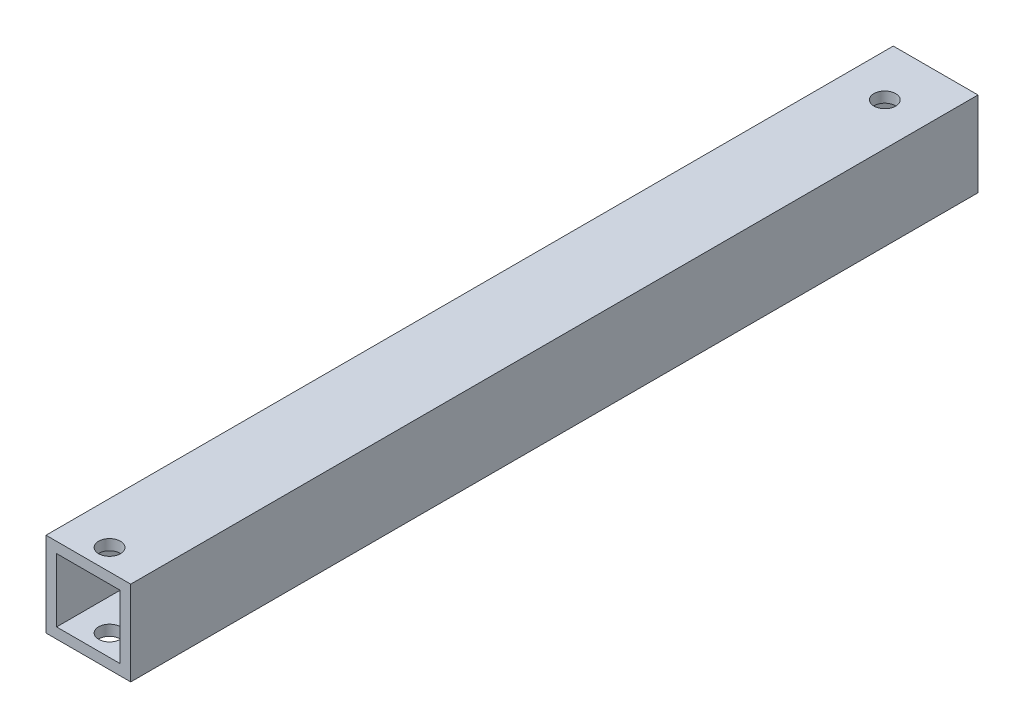
ISO-10303-21;
HEADER;
FILE_DESCRIPTION(('STEP AP214'),'2;1');
FILE_NAME('part.step','',(''),(''),'','','');
FILE_SCHEMA(('AUTOMOTIVE_DESIGN { 1 0 10303 214 1 1 1 1 }'));
ENDSEC;
DATA;
#1=APPLICATION_CONTEXT('core data for automotive mechanical design processes');
#2=APPLICATION_PROTOCOL_DEFINITION('international standard','automotive_design',2000,#1);
#3=PRODUCT_CONTEXT('',#1,'mechanical');
#4=PRODUCT('Part','Part','',(#3));
#5=PRODUCT_RELATED_PRODUCT_CATEGORY('part','',(#4));
#6=PRODUCT_DEFINITION_FORMATION('','',#4);
#7=PRODUCT_DEFINITION_CONTEXT('part definition',#1,'design');
#8=PRODUCT_DEFINITION('design','',#6,#7);
#9=PRODUCT_DEFINITION_SHAPE('','',#8);
#10=(LENGTH_UNIT() NAMED_UNIT(*) SI_UNIT(.MILLI.,.METRE.));
#11=(NAMED_UNIT(*) PLANE_ANGLE_UNIT() SI_UNIT($,.RADIAN.));
#12=(NAMED_UNIT(*) SI_UNIT($,.STERADIAN.) SOLID_ANGLE_UNIT());
#13=UNCERTAINTY_MEASURE_WITH_UNIT(LENGTH_MEASURE(1.E-05),#10,'distance_accuracy_value','');
#14=(GEOMETRIC_REPRESENTATION_CONTEXT(3) GLOBAL_UNCERTAINTY_ASSIGNED_CONTEXT((#13)) GLOBAL_UNIT_ASSIGNED_CONTEXT((#10,
#11,#12)) REPRESENTATION_CONTEXT('',''));
#15=CARTESIAN_POINT('',(0.,0.,0.));
#16=DIRECTION('',(0.,0.,1.));
#17=DIRECTION('',(1.,0.,0.));
#18=AXIS2_PLACEMENT_3D('',#15,#16,#17);
#19=CARTESIAN_POINT('',(0.,0.,254.));
#20=DIRECTION('',(0.,0.,-1.));
#21=DIRECTION('',(-1.,0.,0.));
#22=AXIS2_PLACEMENT_3D('',#19,#20,#21);
#23=PLANE('',#22);
#24=DIRECTION('',(-1.,0.,0.));
#25=VECTOR('',#24,1.);
#26=CARTESIAN_POINT('',(12.7000000000001,-12.7,254.));
#27=LINE('',#26,#25);
#28=CARTESIAN_POINT('',(12.7000000000001,-12.7,254.));
#29=VERTEX_POINT('',#28);
#30=CARTESIAN_POINT('',(-12.6999999999999,-12.7,254.));
#31=VERTEX_POINT('',#30);
#32=EDGE_CURVE('E143',#29,#31,#27,.T.);
#33=ORIENTED_EDGE('',*,*,#32,.F.);
#34=DIRECTION('',(0.,1.,0.));
#35=VECTOR('',#34,1.);
#36=CARTESIAN_POINT('',(12.7000000000001,-12.7,254.));
#37=LINE('',#36,#35);
#38=CARTESIAN_POINT('',(12.7000000000001,12.7,254.));
#39=VERTEX_POINT('',#38);
#40=EDGE_CURVE('E152',#29,#39,#37,.T.);
#41=ORIENTED_EDGE('',*,*,#40,.T.);
#42=DIRECTION('',(-1.,0.,0.));
#43=VECTOR('',#42,1.);
#44=CARTESIAN_POINT('',(12.7000000000001,12.7,254.));
#45=LINE('',#44,#43);
#46=CARTESIAN_POINT('',(-12.6999999999999,12.7,254.));
#47=VERTEX_POINT('',#46);
#48=EDGE_CURVE('E150',#39,#47,#45,.T.);
#49=ORIENTED_EDGE('',*,*,#48,.T.);
#50=DIRECTION('',(0.,1.,0.));
#51=VECTOR('',#50,1.);
#52=CARTESIAN_POINT('',(-12.6999999999999,-12.7,254.));
#53=LINE('',#52,#51);
#54=EDGE_CURVE('E146',#31,#47,#53,.T.);
#55=ORIENTED_EDGE('',*,*,#54,.F.);
#56=EDGE_LOOP('',(#33,#41,#49,#55));
#57=FACE_BOUND('',#56,.T.);
#58=DIRECTION('',(0.,1.,0.));
#59=VECTOR('',#58,1.);
#60=CARTESIAN_POINT('',(9.52500000000005,-9.52499999999999,254.));
#61=LINE('',#60,#59);
#62=CARTESIAN_POINT('',(9.52500000000005,-9.52499999999999,254.));
#63=VERTEX_POINT('',#62);
#64=CARTESIAN_POINT('',(9.52500000000005,9.52499999999999,254.));
#65=VERTEX_POINT('',#64);
#66=EDGE_CURVE('E105',#63,#65,#61,.T.);
#67=ORIENTED_EDGE('',*,*,#66,.F.);
#68=DIRECTION('',(1.,0.,0.));
#69=VECTOR('',#68,1.);
#70=CARTESIAN_POINT('',(-9.52500000000006,-9.52499999999999,254.));
#71=LINE('',#70,#69);
#72=CARTESIAN_POINT('',(-9.52500000000006,-9.52499999999999,254.));
#73=VERTEX_POINT('',#72);
#74=EDGE_CURVE('E127',#73,#63,#71,.T.);
#75=ORIENTED_EDGE('',*,*,#74,.F.);
#76=DIRECTION('',(0.,-1.,0.));
#77=VECTOR('',#76,1.);
#78=CARTESIAN_POINT('',(-9.52500000000006,-9.52499999999999,254.));
#79=LINE('',#78,#77);
#80=CARTESIAN_POINT('',(-9.52500000000006,9.52499999999999,254.));
#81=VERTEX_POINT('',#80);
#82=EDGE_CURVE('E125',#81,#73,#79,.T.);
#83=ORIENTED_EDGE('',*,*,#82,.F.);
#84=DIRECTION('',(-1.,0.,0.));
#85=VECTOR('',#84,1.);
#86=CARTESIAN_POINT('',(-9.52500000000006,9.52499999999999,254.));
#87=LINE('',#86,#85);
#88=EDGE_CURVE('E113',#65,#81,#87,.T.);
#89=ORIENTED_EDGE('',*,*,#88,.F.);
#90=EDGE_LOOP('',(#67,#75,#83,#89));
#91=FACE_BOUND('',#90,.T.);
#92=ADVANCED_FACE('F39',(#57,#91),#23,.F.);
#93=CARTESIAN_POINT('',(0.,0.,0.));
#94=DIRECTION('',(0.,0.,-1.));
#95=DIRECTION('',(-1.,0.,0.));
#96=AXIS2_PLACEMENT_3D('',#93,#94,#95);
#97=PLANE('',#96);
#98=DIRECTION('',(-1.,0.,0.));
#99=VECTOR('',#98,1.);
#100=CARTESIAN_POINT('',(12.7000000000001,-12.7,0.));
#101=LINE('',#100,#99);
#102=CARTESIAN_POINT('',(12.7000000000001,-12.7,0.));
#103=VERTEX_POINT('',#102);
#104=CARTESIAN_POINT('',(-12.6999999999999,-12.7,0.));
#105=VERTEX_POINT('',#104);
#106=EDGE_CURVE('E121',#103,#105,#101,.T.);
#107=ORIENTED_EDGE('',*,*,#106,.T.);
#108=DIRECTION('',(0.,1.,0.));
#109=VECTOR('',#108,1.);
#110=CARTESIAN_POINT('',(-12.6999999999999,-12.7,0.));
#111=LINE('',#110,#109);
#112=CARTESIAN_POINT('',(-12.6999999999999,12.7,0.));
#113=VERTEX_POINT('',#112);
#114=EDGE_CURVE('E157',#105,#113,#111,.T.);
#115=ORIENTED_EDGE('',*,*,#114,.T.);
#116=DIRECTION('',(-1.,0.,0.));
#117=VECTOR('',#116,1.);
#118=CARTESIAN_POINT('',(12.7000000000001,12.7,0.));
#119=LINE('',#118,#117);
#120=CARTESIAN_POINT('',(12.7000000000001,12.7,0.));
#121=VERTEX_POINT('',#120);
#122=EDGE_CURVE('E160',#121,#113,#119,.T.);
#123=ORIENTED_EDGE('',*,*,#122,.F.);
#124=DIRECTION('',(0.,1.,0.));
#125=VECTOR('',#124,1.);
#126=CARTESIAN_POINT('',(12.7000000000001,-12.7,0.));
#127=LINE('',#126,#125);
#128=EDGE_CURVE('E147',#103,#121,#127,.T.);
#129=ORIENTED_EDGE('',*,*,#128,.F.);
#130=EDGE_LOOP('',(#107,#115,#123,#129));
#131=FACE_BOUND('',#130,.T.);
#132=DIRECTION('',(1.,0.,0.));
#133=VECTOR('',#132,1.);
#134=CARTESIAN_POINT('',(-9.52500000000006,-9.52499999999999,0.));
#135=LINE('',#134,#133);
#136=CARTESIAN_POINT('',(-9.52500000000006,-9.52499999999999,0.));
#137=VERTEX_POINT('',#136);
#138=CARTESIAN_POINT('',(9.52500000000005,-9.52499999999999,0.));
#139=VERTEX_POINT('',#138);
#140=EDGE_CURVE('E114',#137,#139,#135,.T.);
#141=ORIENTED_EDGE('',*,*,#140,.T.);
#142=DIRECTION('',(0.,1.,0.));
#143=VECTOR('',#142,1.);
#144=CARTESIAN_POINT('',(9.52500000000005,-9.52499999999999,0.));
#145=LINE('',#144,#143);
#146=CARTESIAN_POINT('',(9.52500000000005,9.52499999999999,0.));
#147=VERTEX_POINT('',#146);
#148=EDGE_CURVE('E64',#139,#147,#145,.T.);
#149=ORIENTED_EDGE('',*,*,#148,.T.);
#150=DIRECTION('',(-1.,0.,0.));
#151=VECTOR('',#150,1.);
#152=CARTESIAN_POINT('',(-9.52500000000006,9.52499999999999,0.));
#153=LINE('',#152,#151);
#154=CARTESIAN_POINT('',(-9.52500000000006,9.52499999999999,0.));
#155=VERTEX_POINT('',#154);
#156=EDGE_CURVE('E120',#147,#155,#153,.T.);
#157=ORIENTED_EDGE('',*,*,#156,.T.);
#158=DIRECTION('',(0.,-1.,0.));
#159=VECTOR('',#158,1.);
#160=CARTESIAN_POINT('',(-9.52500000000006,-9.52499999999999,0.));
#161=LINE('',#160,#159);
#162=EDGE_CURVE('E135',#155,#137,#161,.T.);
#163=ORIENTED_EDGE('',*,*,#162,.T.);
#164=EDGE_LOOP('',(#141,#149,#157,#163));
#165=FACE_BOUND('',#164,.T.);
#166=ADVANCED_FACE('F192',(#131,#165),#97,.T.);
#167=CARTESIAN_POINT('',(12.7000000000001,-12.7,254.));
#168=DIRECTION('',(0.,-1.,0.));
#169=DIRECTION('',(0.,0.,-1.));
#170=AXIS2_PLACEMENT_3D('',#167,#168,#169);
#171=PLANE('',#170);
#172=CARTESIAN_POINT('',(0.,-12.7,247.65));
#173=DIRECTION('',(0.,1.,0.));
#174=DIRECTION('',(0.,0.,1.));
#175=AXIS2_PLACEMENT_3D('',#172,#173,#174);
#176=CIRCLE('',#175,3.2639);
#177=CARTESIAN_POINT('',(0.,-12.7,250.9139));
#178=VERTEX_POINT('',#177);
#179=EDGE_CURVE('E335',#178,#178,#176,.T.);
#180=ORIENTED_EDGE('',*,*,#179,.T.);
#181=EDGE_LOOP('',(#180));
#182=FACE_BOUND('',#181,.T.);
#183=CARTESIAN_POINT('',(0.,-12.7,15.24));
#184=DIRECTION('',(0.,-1.,0.));
#185=DIRECTION('',(0.,0.,-1.));
#186=AXIS2_PLACEMENT_3D('',#183,#184,#185);
#187=CIRCLE('',#186,3.2639);
#188=CARTESIAN_POINT('',(0.,-12.7,18.5039));
#189=VERTEX_POINT('',#188);
#190=EDGE_CURVE('E133',#189,#189,#187,.T.);
#191=ORIENTED_EDGE('',*,*,#190,.F.);
#192=EDGE_LOOP('',(#191));
#193=FACE_BOUND('',#192,.T.);
#194=ORIENTED_EDGE('',*,*,#106,.F.);
#195=DIRECTION('',(0.,0.,-1.));
#196=VECTOR('',#195,1.);
#197=CARTESIAN_POINT('',(12.7000000000001,-12.7,254.));
#198=LINE('',#197,#196);
#199=EDGE_CURVE('E11',#29,#103,#198,.T.);
#200=ORIENTED_EDGE('',*,*,#199,.F.);
#201=ORIENTED_EDGE('',*,*,#32,.T.);
#202=DIRECTION('',(0.,0.,-1.));
#203=VECTOR('',#202,1.);
#204=CARTESIAN_POINT('',(-12.6999999999999,-12.7,254.));
#205=LINE('',#204,#203);
#206=EDGE_CURVE('E154',#31,#105,#205,.T.);
#207=ORIENTED_EDGE('',*,*,#206,.T.);
#208=EDGE_LOOP('',(#194,#200,#201,#207));
#209=FACE_BOUND('',#208,.T.);
#210=ADVANCED_FACE('F41',(#182,#193,#209),#171,.T.);
#211=CARTESIAN_POINT('',(12.7000000000001,-12.7,254.));
#212=DIRECTION('',(-1.,0.,0.));
#213=DIRECTION('',(0.,0.,1.));
#214=AXIS2_PLACEMENT_3D('',#211,#212,#213);
#215=PLANE('',#214);
#216=ORIENTED_EDGE('',*,*,#128,.T.);
#217=DIRECTION('',(0.,0.,-1.));
#218=VECTOR('',#217,1.);
#219=CARTESIAN_POINT('',(12.7000000000001,12.7,254.));
#220=LINE('',#219,#218);
#221=EDGE_CURVE('E48',#39,#121,#220,.T.);
#222=ORIENTED_EDGE('',*,*,#221,.F.);
#223=ORIENTED_EDGE('',*,*,#40,.F.);
#224=ORIENTED_EDGE('',*,*,#199,.T.);
#225=EDGE_LOOP('',(#216,#222,#223,#224));
#226=FACE_BOUND('',#225,.T.);
#227=ADVANCED_FACE('F191',(#226),#215,.F.);
#228=CARTESIAN_POINT('',(12.7000000000001,12.7,254.));
#229=DIRECTION('',(0.,-1.,0.));
#230=DIRECTION('',(0.,0.,-1.));
#231=AXIS2_PLACEMENT_3D('',#228,#229,#230);
#232=PLANE('',#231);
#233=CARTESIAN_POINT('',(0.,12.7,247.65));
#234=DIRECTION('',(0.,1.,0.));
#235=DIRECTION('',(0.,0.,1.));
#236=AXIS2_PLACEMENT_3D('',#233,#234,#235);
#237=CIRCLE('',#236,3.2639);
#238=CARTESIAN_POINT('',(0.,12.7,250.9139));
#239=VERTEX_POINT('',#238);
#240=EDGE_CURVE('E334',#239,#239,#237,.T.);
#241=ORIENTED_EDGE('',*,*,#240,.F.);
#242=EDGE_LOOP('',(#241));
#243=FACE_BOUND('',#242,.T.);
#244=CARTESIAN_POINT('',(0.,12.7,15.24));
#245=DIRECTION('',(0.,1.,0.));
#246=DIRECTION('',(0.,0.,1.));
#247=AXIS2_PLACEMENT_3D('',#244,#245,#246);
#248=CIRCLE('',#247,3.2639);
#249=CARTESIAN_POINT('',(0.,12.7,18.5039));
#250=VERTEX_POINT('',#249);
#251=EDGE_CURVE('E171',#250,#250,#248,.T.);
#252=ORIENTED_EDGE('',*,*,#251,.F.);
#253=EDGE_LOOP('',(#252));
#254=FACE_BOUND('',#253,.T.);
#255=ORIENTED_EDGE('',*,*,#122,.T.);
#256=DIRECTION('',(0.,0.,-1.));
#257=VECTOR('',#256,1.);
#258=CARTESIAN_POINT('',(-12.6999999999999,12.7,254.));
#259=LINE('',#258,#257);
#260=EDGE_CURVE('E166',#47,#113,#259,.T.);
#261=ORIENTED_EDGE('',*,*,#260,.F.);
#262=ORIENTED_EDGE('',*,*,#48,.F.);
#263=ORIENTED_EDGE('',*,*,#221,.T.);
#264=EDGE_LOOP('',(#255,#261,#262,#263));
#265=FACE_BOUND('',#264,.T.);
#266=ADVANCED_FACE('F205',(#243,#254,#265),#232,.F.);
#267=CARTESIAN_POINT('',(-12.6999999999999,-12.7,254.));
#268=DIRECTION('',(-1.,0.,0.));
#269=DIRECTION('',(0.,0.,1.));
#270=AXIS2_PLACEMENT_3D('',#267,#268,#269);
#271=PLANE('',#270);
#272=ORIENTED_EDGE('',*,*,#114,.F.);
#273=ORIENTED_EDGE('',*,*,#206,.F.);
#274=ORIENTED_EDGE('',*,*,#54,.T.);
#275=ORIENTED_EDGE('',*,*,#260,.T.);
#276=EDGE_LOOP('',(#272,#273,#274,#275));
#277=FACE_BOUND('',#276,.T.);
#278=ADVANCED_FACE('F211',(#277),#271,.T.);
#279=CARTESIAN_POINT('',(9.52500000000005,-9.52499999999999,254.));
#280=DIRECTION('',(-1.,0.,0.));
#281=DIRECTION('',(0.,0.,1.));
#282=AXIS2_PLACEMENT_3D('',#279,#280,#281);
#283=PLANE('',#282);
#284=ORIENTED_EDGE('',*,*,#148,.F.);
#285=DIRECTION('',(0.,0.,-1.));
#286=VECTOR('',#285,1.);
#287=CARTESIAN_POINT('',(9.52500000000005,-9.52499999999999,254.));
#288=LINE('',#287,#286);
#289=EDGE_CURVE('E109',#63,#139,#288,.T.);
#290=ORIENTED_EDGE('',*,*,#289,.F.);
#291=ORIENTED_EDGE('',*,*,#66,.T.);
#292=DIRECTION('',(0.,0.,-1.));
#293=VECTOR('',#292,1.);
#294=CARTESIAN_POINT('',(9.52500000000005,9.52499999999999,254.));
#295=LINE('',#294,#293);
#296=EDGE_CURVE('E108',#65,#147,#295,.T.);
#297=ORIENTED_EDGE('',*,*,#296,.T.);
#298=EDGE_LOOP('',(#284,#290,#291,#297));
#299=FACE_BOUND('',#298,.T.);
#300=ADVANCED_FACE('F107',(#299),#283,.T.);
#301=CARTESIAN_POINT('',(-9.52500000000006,9.52499999999999,254.));
#302=DIRECTION('',(0.,-1.,0.));
#303=DIRECTION('',(0.,0.,-1.));
#304=AXIS2_PLACEMENT_3D('',#301,#302,#303);
#305=PLANE('',#304);
#306=CARTESIAN_POINT('',(0.,9.52499999999999,247.65));
#307=DIRECTION('',(0.,-1.,0.));
#308=DIRECTION('',(0.,0.,-1.));
#309=AXIS2_PLACEMENT_3D('',#306,#307,#308);
#310=CIRCLE('',#309,3.2639);
#311=CARTESIAN_POINT('',(0.,9.52499999999999,244.3861));
#312=VERTEX_POINT('',#311);
#313=EDGE_CURVE('E177',#312,#312,#310,.T.);
#314=ORIENTED_EDGE('',*,*,#313,.F.);
#315=EDGE_LOOP('',(#314));
#316=FACE_BOUND('',#315,.T.);
#317=CARTESIAN_POINT('',(0.,9.52500000000001,15.24));
#318=DIRECTION('',(0.,-1.,0.));
#319=DIRECTION('',(0.,0.,-1.));
#320=AXIS2_PLACEMENT_3D('',#317,#318,#319);
#321=CIRCLE('',#320,3.2639);
#322=CARTESIAN_POINT('',(0.,9.52500000000006,18.5039));
#323=VERTEX_POINT('',#322);
#324=EDGE_CURVE('E170',#323,#323,#321,.T.);
#325=ORIENTED_EDGE('',*,*,#324,.F.);
#326=EDGE_LOOP('',(#325));
#327=FACE_BOUND('',#326,.T.);
#328=ORIENTED_EDGE('',*,*,#156,.F.);
#329=ORIENTED_EDGE('',*,*,#296,.F.);
#330=ORIENTED_EDGE('',*,*,#88,.T.);
#331=DIRECTION('',(0.,0.,-1.));
#332=VECTOR('',#331,1.);
#333=CARTESIAN_POINT('',(-9.52500000000006,9.52499999999999,254.));
#334=LINE('',#333,#332);
#335=EDGE_CURVE('E122',#81,#155,#334,.T.);
#336=ORIENTED_EDGE('',*,*,#335,.T.);
#337=EDGE_LOOP('',(#328,#329,#330,#336));
#338=FACE_BOUND('',#337,.T.);
#339=ADVANCED_FACE('F117',(#316,#327,#338),#305,.T.);
#340=CARTESIAN_POINT('',(-9.52500000000006,-9.52499999999999,254.));
#341=DIRECTION('',(1.,0.,0.));
#342=DIRECTION('',(0.,0.,-1.));
#343=AXIS2_PLACEMENT_3D('',#340,#341,#342);
#344=PLANE('',#343);
#345=ORIENTED_EDGE('',*,*,#162,.F.);
#346=ORIENTED_EDGE('',*,*,#335,.F.);
#347=ORIENTED_EDGE('',*,*,#82,.T.);
#348=DIRECTION('',(0.,0.,-1.));
#349=VECTOR('',#348,1.);
#350=CARTESIAN_POINT('',(-9.52500000000006,-9.52499999999999,254.));
#351=LINE('',#350,#349);
#352=EDGE_CURVE('E56',#73,#137,#351,.T.);
#353=ORIENTED_EDGE('',*,*,#352,.T.);
#354=EDGE_LOOP('',(#345,#346,#347,#353));
#355=FACE_BOUND('',#354,.T.);
#356=ADVANCED_FACE('F250',(#355),#344,.T.);
#357=CARTESIAN_POINT('',(-9.52500000000006,-9.52499999999999,254.));
#358=DIRECTION('',(0.,1.,0.));
#359=DIRECTION('',(0.,0.,1.));
#360=AXIS2_PLACEMENT_3D('',#357,#358,#359);
#361=PLANE('',#360);
#362=CARTESIAN_POINT('',(0.,-9.52499999999999,247.65));
#363=DIRECTION('',(0.,1.,0.));
#364=DIRECTION('',(0.,0.,1.));
#365=AXIS2_PLACEMENT_3D('',#362,#363,#364);
#366=CIRCLE('',#365,3.2639);
#367=CARTESIAN_POINT('',(0.,-9.52499999999999,250.9139));
#368=VERTEX_POINT('',#367);
#369=EDGE_CURVE('E43',#368,#368,#366,.T.);
#370=ORIENTED_EDGE('',*,*,#369,.F.);
#371=EDGE_LOOP('',(#370));
#372=FACE_BOUND('',#371,.T.);
#373=CARTESIAN_POINT('',(0.,-9.52500000000001,15.24));
#374=DIRECTION('',(0.,1.,0.));
#375=DIRECTION('',(0.,0.,1.));
#376=AXIS2_PLACEMENT_3D('',#373,#374,#375);
#377=CIRCLE('',#376,3.2639);
#378=CARTESIAN_POINT('',(0.,-9.52500000000006,18.5039));
#379=VERTEX_POINT('',#378);
#380=EDGE_CURVE('E168',#379,#379,#377,.T.);
#381=ORIENTED_EDGE('',*,*,#380,.F.);
#382=EDGE_LOOP('',(#381));
#383=FACE_BOUND('',#382,.T.);
#384=ORIENTED_EDGE('',*,*,#140,.F.);
#385=ORIENTED_EDGE('',*,*,#352,.F.);
#386=ORIENTED_EDGE('',*,*,#74,.T.);
#387=ORIENTED_EDGE('',*,*,#289,.T.);
#388=EDGE_LOOP('',(#384,#385,#386,#387));
#389=FACE_BOUND('',#388,.T.);
#390=ADVANCED_FACE('F258',(#372,#383,#389),#361,.T.);
#391=CARTESIAN_POINT('',(0.,-292.1,15.24));
#392=DIRECTION('',(0.,1.,0.));
#393=DIRECTION('',(0.,0.,1.));
#394=AXIS2_PLACEMENT_3D('',#391,#392,#393);
#395=CYLINDRICAL_SURFACE('',#394,3.2639);
#396=CARTESIAN_POINT('',(0.,-12.7,18.5039));
#397=CARTESIAN_POINT('',(0.,-12.6669270833333,18.5039));
#398=CARTESIAN_POINT('',(0.,-12.6338541666666,18.5039));
#399=CARTESIAN_POINT('',(0.,-12.5677083333333,18.5039));
#400=CARTESIAN_POINT('',(0.,-12.5346354166667,18.5039));
#401=CARTESIAN_POINT('',(0.,-12.4684895833333,18.5039));
#402=CARTESIAN_POINT('',(0.,-12.4354166666667,18.5039));
#403=CARTESIAN_POINT('',(0.,-12.3692708333333,18.5039));
#404=CARTESIAN_POINT('',(0.,-12.3361979166667,18.5039));
#405=CARTESIAN_POINT('',(0.,-12.2700520833334,18.5039));
#406=CARTESIAN_POINT('',(0.,-12.2369791666667,18.5039));
#407=CARTESIAN_POINT('',(0.,-12.1708333333333,18.5039));
#408=CARTESIAN_POINT('',(0.,-12.1377604166667,18.5039));
#409=CARTESIAN_POINT('',(0.,-12.0716145833333,18.5039));
#410=CARTESIAN_POINT('',(0.,-12.0385416666667,18.5039));
#411=CARTESIAN_POINT('',(0.,-11.9723958333334,18.5039));
#412=CARTESIAN_POINT('',(0.,-11.9393229166667,18.5039));
#413=CARTESIAN_POINT('',(0.,-11.8731770833333,18.5039));
#414=CARTESIAN_POINT('',(0.,-11.8401041666667,18.5039));
#415=CARTESIAN_POINT('',(0.,-11.7739583333333,18.5039));
#416=CARTESIAN_POINT('',(0.,-11.7408854166667,18.5039));
#417=CARTESIAN_POINT('',(0.,-11.6747395833334,18.5039));
#418=CARTESIAN_POINT('',(0.,-11.6416666666667,18.5039));
#419=CARTESIAN_POINT('',(0.,-11.5755208333333,18.5039));
#420=CARTESIAN_POINT('',(0.,-11.5424479166667,18.5039));
#421=CARTESIAN_POINT('',(0.,-11.4763020833333,18.5039));
#422=CARTESIAN_POINT('',(0.,-11.4432291666667,18.5039));
#423=CARTESIAN_POINT('',(0.,-11.3770833333334,18.5039));
#424=CARTESIAN_POINT('',(0.,-11.3440104166667,18.5039));
#425=CARTESIAN_POINT('',(0.,-11.2778645833334,18.5039));
#426=CARTESIAN_POINT('',(0.,-11.2447916666667,18.5039));
#427=CARTESIAN_POINT('',(0.,-11.1786458333334,18.5039));
#428=CARTESIAN_POINT('',(0.,-11.1455729166667,18.5039));
#429=CARTESIAN_POINT('',(0.,-11.0794270833334,18.5039));
#430=CARTESIAN_POINT('',(0.,-11.0463541666667,18.5039));
#431=CARTESIAN_POINT('',(0.,-10.9802083333334,18.5039));
#432=CARTESIAN_POINT('',(0.,-10.9471354166667,18.5039));
#433=CARTESIAN_POINT('',(0.,-10.8809895833334,18.5039));
#434=CARTESIAN_POINT('',(0.,-10.8479166666667,18.5039));
#435=CARTESIAN_POINT('',(0.,-10.7817708333334,18.5039));
#436=CARTESIAN_POINT('',(0.,-10.7486979166667,18.5039));
#437=CARTESIAN_POINT('',(0.,-10.6825520833334,18.5039));
#438=CARTESIAN_POINT('',(0.,-10.6494791666667,18.5039));
#439=CARTESIAN_POINT('',(0.,-10.5833333333334,18.5039));
#440=CARTESIAN_POINT('',(0.,-10.5502604166667,18.5039));
#441=CARTESIAN_POINT('',(0.,-10.4841145833334,18.5039));
#442=CARTESIAN_POINT('',(0.,-10.4510416666667,18.5039));
#443=CARTESIAN_POINT('',(0.,-10.3848958333334,18.5039));
#444=CARTESIAN_POINT('',(0.,-10.3518229166667,18.5039));
#445=CARTESIAN_POINT('',(0.,-10.2856770833334,18.5039));
#446=CARTESIAN_POINT('',(0.,-10.2526041666667,18.5039));
#447=CARTESIAN_POINT('',(0.,-10.1864583333334,18.5039));
#448=CARTESIAN_POINT('',(0.,-10.1533854166667,18.5039));
#449=CARTESIAN_POINT('',(0.,-10.0872395833334,18.5039));
#450=CARTESIAN_POINT('',(0.,-10.0541666666667,18.5039));
#451=CARTESIAN_POINT('',(0.,-9.98802083333337,18.5039));
#452=CARTESIAN_POINT('',(0.,-9.9549479166667,18.5039));
#453=CARTESIAN_POINT('',(0.,-9.88880208333337,18.5039));
#454=CARTESIAN_POINT('',(0.,-9.85572916666672,18.5039));
#455=CARTESIAN_POINT('',(0.,-9.78958333333339,18.5039));
#456=CARTESIAN_POINT('',(0.,-9.75651041666672,18.5039));
#457=CARTESIAN_POINT('',(0.,-9.69036458333339,18.5039));
#458=CARTESIAN_POINT('',(0.,-9.65729166666673,18.5039));
#459=CARTESIAN_POINT('',(0.,-9.59114583333341,18.5039));
#460=CARTESIAN_POINT('',(0.,-9.55807291666673,18.5039));
#461=CARTESIAN_POINT('',(0.,-9.52500000000006,18.5039));
#462=B_SPLINE_CURVE_WITH_KNOTS('',3,(#396,#397,#398,#399,#400,#401,#402,#403,#404,#405,#406,
#407,#408,#409,#410,#411,#412,#413,#414,#415,#416,#417,#418,#419,#420,#421,#422,#423,#424,#425,
#426,#427,#428,#429,#430,#431,#432,#433,#434,#435,#436,#437,#438,#439,#440,#441,#442,#443,#444,
#445,#446,#447,#448,#449,#450,#451,#452,#453,#454,#455,#456,#457,#458,#459,#460,#461),
.UNSPECIFIED.,.F.,.F.,(4,2,2,2,2,2,2,2,2,2,2,2,2,2,2,2,2,2,2,2,2,2,2,2,2,2,2,2,2,2,2,2,4),(0.,
0.0992187500000186,0.198437499999982,0.29765625,0.396874999999963,0.496093749999982,0.5953125,
0.694531249999963,0.793749999999982,0.892968750000001,0.992187499999964,1.09140624999998,
1.190625,1.28984374999996,1.38906249999998,1.48828124999995,1.58749999999996,1.68671874999998,
1.78593749999995,1.88515624999996,1.98437499999993,2.08359374999995,2.18281249999996,
2.28203124999993,2.38124999999995,2.48046874999996,2.57968749999993,2.67890624999995,
2.77812499999996,2.87734374999993,2.97656249999995,3.07578124999991,3.17499999999993),.UNSPECIFIED.);
#463=EDGE_CURVE('BSEAM187',#189,#379,#462,.T.);
#464=ORIENTED_EDGE('',*,*,#190,.T.);
#465=ORIENTED_EDGE('',*,*,#380,.T.);
#466=ORIENTED_EDGE('',*,*,#463,.T.);
#467=ORIENTED_EDGE('',*,*,#463,.F.);
#468=EDGE_LOOP('',(#464,#466,#465,#467));
#469=FACE_BOUND('',#468,.T.);
#470=ADVANCED_FACE('F187',(#469),#395,.F.);
#471=CARTESIAN_POINT('',(0.,9.52500000000006,18.5039));
#472=CARTESIAN_POINT('',(0.,9.55807291666673,18.5039));
#473=CARTESIAN_POINT('',(0.,9.59114583333341,18.5039));
#474=CARTESIAN_POINT('',(0.,9.65729166666673,18.5039));
#475=CARTESIAN_POINT('',(0.,9.69036458333339,18.5039));
#476=CARTESIAN_POINT('',(0.,9.75651041666672,18.5039));
#477=CARTESIAN_POINT('',(0.,9.78958333333339,18.5039));
#478=CARTESIAN_POINT('',(0.,9.85572916666672,18.5039));
#479=CARTESIAN_POINT('',(0.,9.88880208333337,18.5039));
#480=CARTESIAN_POINT('',(0.,9.9549479166667,18.5039));
#481=CARTESIAN_POINT('',(0.,9.98802083333337,18.5039));
#482=CARTESIAN_POINT('',(0.,10.0541666666667,18.5039));
#483=CARTESIAN_POINT('',(0.,10.0872395833334,18.5039));
#484=CARTESIAN_POINT('',(0.,10.1533854166667,18.5039));
#485=CARTESIAN_POINT('',(0.,10.1864583333334,18.5039));
#486=CARTESIAN_POINT('',(0.,10.2526041666667,18.5039));
#487=CARTESIAN_POINT('',(0.,10.2856770833334,18.5039));
#488=CARTESIAN_POINT('',(0.,10.3518229166667,18.5039));
#489=CARTESIAN_POINT('',(0.,10.3848958333334,18.5039));
#490=CARTESIAN_POINT('',(0.,10.4510416666667,18.5039));
#491=CARTESIAN_POINT('',(0.,10.4841145833334,18.5039));
#492=CARTESIAN_POINT('',(0.,10.5502604166667,18.5039));
#493=CARTESIAN_POINT('',(0.,10.5833333333334,18.5039));
#494=CARTESIAN_POINT('',(0.,10.6494791666667,18.5039));
#495=CARTESIAN_POINT('',(0.,10.6825520833334,18.5039));
#496=CARTESIAN_POINT('',(0.,10.7486979166667,18.5039));
#497=CARTESIAN_POINT('',(0.,10.7817708333334,18.5039));
#498=CARTESIAN_POINT('',(0.,10.8479166666667,18.5039));
#499=CARTESIAN_POINT('',(0.,10.8809895833334,18.5039));
#500=CARTESIAN_POINT('',(0.,10.9471354166667,18.5039));
#501=CARTESIAN_POINT('',(0.,10.9802083333334,18.5039));
#502=CARTESIAN_POINT('',(0.,11.0463541666667,18.5039));
#503=CARTESIAN_POINT('',(0.,11.0794270833334,18.5039));
#504=CARTESIAN_POINT('',(0.,11.1455729166667,18.5039));
#505=CARTESIAN_POINT('',(0.,11.1786458333334,18.5039));
#506=CARTESIAN_POINT('',(0.,11.2447916666667,18.5039));
#507=CARTESIAN_POINT('',(0.,11.2778645833334,18.5039));
#508=CARTESIAN_POINT('',(0.,11.3440104166667,18.5039));
#509=CARTESIAN_POINT('',(0.,11.3770833333334,18.5039));
#510=CARTESIAN_POINT('',(0.,11.4432291666667,18.5039));
#511=CARTESIAN_POINT('',(0.,11.4763020833333,18.5039));
#512=CARTESIAN_POINT('',(0.,11.5424479166667,18.5039));
#513=CARTESIAN_POINT('',(0.,11.5755208333333,18.5039));
#514=CARTESIAN_POINT('',(0.,11.6416666666667,18.5039));
#515=CARTESIAN_POINT('',(0.,11.6747395833334,18.5039));
#516=CARTESIAN_POINT('',(0.,11.7408854166667,18.5039));
#517=CARTESIAN_POINT('',(0.,11.7739583333333,18.5039));
#518=CARTESIAN_POINT('',(0.,11.8401041666667,18.5039));
#519=CARTESIAN_POINT('',(0.,11.8731770833333,18.5039));
#520=CARTESIAN_POINT('',(0.,11.9393229166667,18.5039));
#521=CARTESIAN_POINT('',(0.,11.9723958333334,18.5039));
#522=CARTESIAN_POINT('',(0.,12.0385416666667,18.5039));
#523=CARTESIAN_POINT('',(0.,12.0716145833333,18.5039));
#524=CARTESIAN_POINT('',(0.,12.1377604166667,18.5039));
#525=CARTESIAN_POINT('',(0.,12.1708333333333,18.5039));
#526=CARTESIAN_POINT('',(0.,12.2369791666667,18.5039));
#527=CARTESIAN_POINT('',(0.,12.2700520833334,18.5039));
#528=CARTESIAN_POINT('',(0.,12.3361979166667,18.5039));
#529=CARTESIAN_POINT('',(0.,12.3692708333333,18.5039));
#530=CARTESIAN_POINT('',(0.,12.4354166666667,18.5039));
#531=CARTESIAN_POINT('',(0.,12.4684895833333,18.5039));
#532=CARTESIAN_POINT('',(0.,12.5346354166667,18.5039));
#533=CARTESIAN_POINT('',(0.,12.5677083333333,18.5039));
#534=CARTESIAN_POINT('',(0.,12.6338541666666,18.5039));
#535=CARTESIAN_POINT('',(0.,12.6669270833333,18.5039));
#536=CARTESIAN_POINT('',(0.,12.7,18.5039));
#537=B_SPLINE_CURVE_WITH_KNOTS('',3,(#471,#472,#473,#474,#475,#476,#477,#478,#479,#480,#481,
#482,#483,#484,#485,#486,#487,#488,#489,#490,#491,#492,#493,#494,#495,#496,#497,#498,#499,#500,
#501,#502,#503,#504,#505,#506,#507,#508,#509,#510,#511,#512,#513,#514,#515,#516,#517,#518,#519,
#520,#521,#522,#523,#524,#525,#526,#527,#528,#529,#530,#531,#532,#533,#534,#535,#536),
.UNSPECIFIED.,.F.,.F.,(4,2,2,2,2,2,2,2,2,2,2,2,2,2,2,2,2,2,2,2,2,2,2,2,2,2,2,2,2,2,2,2,4),(0.,
0.0992187500000186,0.198437499999982,0.29765625,0.396874999999963,0.496093749999982,0.5953125,
0.694531249999963,0.793749999999982,0.892968750000001,0.992187499999964,1.09140624999998,
1.190625,1.28984374999996,1.38906249999998,1.48828124999995,1.58749999999996,1.68671874999998,
1.78593749999995,1.88515624999996,1.98437499999993,2.08359374999995,2.18281249999996,
2.28203124999993,2.38124999999995,2.48046874999996,2.57968749999993,2.67890624999995,
2.77812499999996,2.87734374999993,2.97656249999995,3.07578124999991,3.17499999999993),.UNSPECIFIED.);
#538=EDGE_CURVE('BSEAM276',#323,#250,#537,.T.);
#539=ORIENTED_EDGE('',*,*,#324,.T.);
#540=ORIENTED_EDGE('',*,*,#251,.T.);
#541=ORIENTED_EDGE('',*,*,#538,.T.);
#542=ORIENTED_EDGE('',*,*,#538,.F.);
#543=EDGE_LOOP('',(#539,#541,#540,#542));
#544=FACE_BOUND('',#543,.T.);
#545=ADVANCED_FACE('F276',(#544),#395,.F.);
#546=CARTESIAN_POINT('',(0.,-12.7,247.65));
#547=DIRECTION('',(0.,1.,0.));
#548=DIRECTION('',(0.,0.,1.));
#549=AXIS2_PLACEMENT_3D('',#546,#547,#548);
#550=CYLINDRICAL_SURFACE('',#549,3.2639);
#551=ORIENTED_EDGE('',*,*,#369,.T.);
#552=EDGE_LOOP('',(#551));
#553=FACE_BOUND('',#552,.T.);
#554=ORIENTED_EDGE('',*,*,#179,.F.);
#555=EDGE_LOOP('',(#554));
#556=FACE_BOUND('',#555,.T.);
#557=ADVANCED_FACE('F270',(#553,#556),#550,.F.);
#558=ORIENTED_EDGE('',*,*,#313,.T.);
#559=EDGE_LOOP('',(#558));
#560=FACE_BOUND('',#559,.T.);
#561=ORIENTED_EDGE('',*,*,#240,.T.);
#562=EDGE_LOOP('',(#561));
#563=FACE_BOUND('',#562,.T.);
#564=ADVANCED_FACE('F275',(#560,#563),#550,.F.);
#565=CLOSED_SHELL('',(#92,#166,#210,#227,#266,#278,#300,#339,#356,#390,#470,#545,#557,#564));
#566=MANIFOLD_SOLID_BREP('B2',#565);
#567=ADVANCED_BREP_SHAPE_REPRESENTATION('',(#18,#566),#14);
#568=SHAPE_DEFINITION_REPRESENTATION(#9,#567);
ENDSEC;
END-ISO-10303-21;
